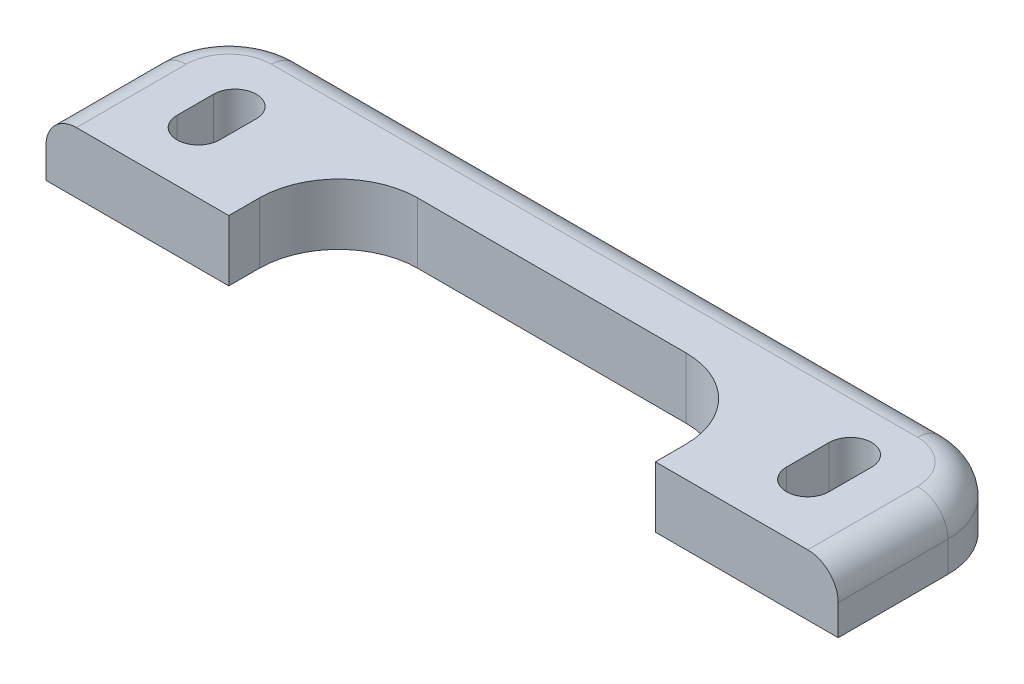
ISO-10303-21;
HEADER;
FILE_DESCRIPTION(('STEP AP214'),'2;1');
FILE_NAME('part.step','',(''),(''),'','','');
FILE_SCHEMA(('AUTOMOTIVE_DESIGN { 1 0 10303 214 1 1 1 1 }'));
ENDSEC;
DATA;
#1=APPLICATION_CONTEXT('core data for automotive mechanical design processes');
#2=APPLICATION_PROTOCOL_DEFINITION('international standard','automotive_design',2000,#1);
#3=PRODUCT_CONTEXT('',#1,'mechanical');
#4=PRODUCT('Part','Part','',(#3));
#5=PRODUCT_RELATED_PRODUCT_CATEGORY('part','',(#4));
#6=PRODUCT_DEFINITION_FORMATION('','',#4);
#7=PRODUCT_DEFINITION_CONTEXT('part definition',#1,'design');
#8=PRODUCT_DEFINITION('design','',#6,#7);
#9=PRODUCT_DEFINITION_SHAPE('','',#8);
#10=(LENGTH_UNIT() NAMED_UNIT(*) SI_UNIT(.MILLI.,.METRE.));
#11=(NAMED_UNIT(*) PLANE_ANGLE_UNIT() SI_UNIT($,.RADIAN.));
#12=(NAMED_UNIT(*) SI_UNIT($,.STERADIAN.) SOLID_ANGLE_UNIT());
#13=UNCERTAINTY_MEASURE_WITH_UNIT(LENGTH_MEASURE(1.E-05),#10,'distance_accuracy_value','');
#14=(GEOMETRIC_REPRESENTATION_CONTEXT(3) GLOBAL_UNCERTAINTY_ASSIGNED_CONTEXT((#13)) GLOBAL_UNIT_ASSIGNED_CONTEXT((#10,
#11,#12)) REPRESENTATION_CONTEXT('',''));
#15=CARTESIAN_POINT('',(0.,0.,0.));
#16=DIRECTION('',(0.,0.,1.));
#17=DIRECTION('',(1.,0.,0.));
#18=AXIS2_PLACEMENT_3D('',#15,#16,#17);
#19=CARTESIAN_POINT('',(-32.5,5.,0.));
#20=DIRECTION('',(0.,0.,-1.));
#21=DIRECTION('',(-1.,0.,0.));
#22=AXIS2_PLACEMENT_3D('',#19,#20,#21);
#23=PLANE('',#22);
#24=DIRECTION('',(1.,0.,0.));
#25=VECTOR('',#24,1.);
#26=CARTESIAN_POINT('',(-32.5,5.,0.));
#27=LINE('',#26,#25);
#28=CARTESIAN_POINT('',(-30.,5.,0.));
#29=VERTEX_POINT('',#28);
#30=CARTESIAN_POINT('',(-17.5,5.,0.));
#31=VERTEX_POINT('',#30);
#32=EDGE_CURVE('E317',#29,#31,#27,.T.);
#33=ORIENTED_EDGE('',*,*,#32,.F.);
#34=CARTESIAN_POINT('',(-30.,2.5,0.));
#35=DIRECTION('',(0.,0.,-1.));
#36=DIRECTION('',(-1.,0.,0.));
#37=AXIS2_PLACEMENT_3D('',#34,#35,#36);
#38=CIRCLE('',#37,2.5);
#39=CARTESIAN_POINT('',(-32.5,2.5,0.));
#40=VERTEX_POINT('',#39);
#41=EDGE_CURVE('E52',#29,#40,#38,.F.);
#42=ORIENTED_EDGE('',*,*,#41,.T.);
#43=DIRECTION('',(0.,-1.,0.));
#44=VECTOR('',#43,1.);
#45=CARTESIAN_POINT('',(-32.5,5.,0.));
#46=LINE('',#45,#44);
#47=CARTESIAN_POINT('',(-32.5,0.,0.));
#48=VERTEX_POINT('',#47);
#49=EDGE_CURVE('E331',#40,#48,#46,.T.);
#50=ORIENTED_EDGE('',*,*,#49,.T.);
#51=DIRECTION('',(1.,0.,0.));
#52=VECTOR('',#51,1.);
#53=CARTESIAN_POINT('',(-32.5,0.,0.));
#54=LINE('',#53,#52);
#55=CARTESIAN_POINT('',(-17.5,0.,0.));
#56=VERTEX_POINT('',#55);
#57=EDGE_CURVE('E321',#48,#56,#54,.T.);
#58=ORIENTED_EDGE('',*,*,#57,.T.);
#59=DIRECTION('',(0.,1.,0.));
#60=VECTOR('',#59,1.);
#61=CARTESIAN_POINT('',(-17.5,0.,0.));
#62=LINE('',#61,#60);
#63=EDGE_CURVE('E290',#56,#31,#62,.T.);
#64=ORIENTED_EDGE('',*,*,#63,.T.);
#65=EDGE_LOOP('',(#33,#42,#50,#58,#64));
#66=FACE_BOUND('',#65,.T.);
#67=ADVANCED_FACE('F43',(#66),#23,.F.);
#68=DIRECTION('',(0.,-1.,0.));
#69=VECTOR('',#68,1.);
#70=CARTESIAN_POINT('',(32.5,5.,0.));
#71=LINE('',#70,#69);
#72=CARTESIAN_POINT('',(32.5,2.5,0.));
#73=VERTEX_POINT('',#72);
#74=CARTESIAN_POINT('',(32.5,0.,0.));
#75=VERTEX_POINT('',#74);
#76=EDGE_CURVE('E319',#73,#75,#71,.T.);
#77=ORIENTED_EDGE('',*,*,#76,.F.);
#78=CARTESIAN_POINT('',(30.,2.5,0.));
#79=DIRECTION('',(0.,0.,-1.));
#80=DIRECTION('',(-1.,0.,0.));
#81=AXIS2_PLACEMENT_3D('',#78,#79,#80);
#82=CIRCLE('',#81,2.5);
#83=CARTESIAN_POINT('',(30.,5.,0.));
#84=VERTEX_POINT('',#83);
#85=EDGE_CURVE('E363',#73,#84,#82,.F.);
#86=ORIENTED_EDGE('',*,*,#85,.T.);
#87=CARTESIAN_POINT('',(17.5,5.,0.));
#88=VERTEX_POINT('',#87);
#89=EDGE_CURVE('E320',#88,#84,#27,.T.);
#90=ORIENTED_EDGE('',*,*,#89,.F.);
#91=DIRECTION('',(0.,1.,0.));
#92=VECTOR('',#91,1.);
#93=CARTESIAN_POINT('',(17.5,0.,0.));
#94=LINE('',#93,#92);
#95=CARTESIAN_POINT('',(17.5,0.,0.));
#96=VERTEX_POINT('',#95);
#97=EDGE_CURVE('E313',#96,#88,#94,.T.);
#98=ORIENTED_EDGE('',*,*,#97,.F.);
#99=EDGE_CURVE('E306',#96,#75,#54,.T.);
#100=ORIENTED_EDGE('',*,*,#99,.T.);
#101=EDGE_LOOP('',(#77,#86,#90,#98,#100));
#102=FACE_BOUND('',#101,.T.);
#103=ADVANCED_FACE('F421',(#102),#23,.F.);
#104=CARTESIAN_POINT('',(32.5,5.,-22.));
#105=DIRECTION('',(-1.,0.,0.));
#106=DIRECTION('',(0.,0.,1.));
#107=AXIS2_PLACEMENT_3D('',#104,#105,#106);
#108=PLANE('',#107);
#109=DIRECTION('',(0.,1.,0.));
#110=VECTOR('',#109,1.);
#111=CARTESIAN_POINT('',(32.5,5.,-9.00000000000001));
#112=LINE('',#111,#110);
#113=CARTESIAN_POINT('',(32.5,0.,-9.00000000000001));
#114=VERTEX_POINT('',#113);
#115=CARTESIAN_POINT('',(32.5,2.5,-9.00000000000001));
#116=VERTEX_POINT('',#115);
#117=EDGE_CURVE('E336',#114,#116,#112,.T.);
#118=ORIENTED_EDGE('',*,*,#117,.T.);
#119=DIRECTION('',(0.,0.,-1.));
#120=VECTOR('',#119,1.);
#121=CARTESIAN_POINT('',(32.5,2.5,-22.));
#122=LINE('',#121,#120);
#123=EDGE_CURVE('E361',#116,#73,#122,.F.);
#124=ORIENTED_EDGE('',*,*,#123,.T.);
#125=ORIENTED_EDGE('',*,*,#76,.T.);
#126=DIRECTION('',(0.,0.,-1.));
#127=VECTOR('',#126,1.);
#128=CARTESIAN_POINT('',(32.5,0.,-22.));
#129=LINE('',#128,#127);
#130=EDGE_CURVE('E324',#75,#114,#129,.T.);
#131=ORIENTED_EDGE('',*,*,#130,.T.);
#132=EDGE_LOOP('',(#118,#124,#125,#131));
#133=FACE_BOUND('',#132,.T.);
#134=ADVANCED_FACE('F441',(#133),#108,.F.);
#135=CARTESIAN_POINT('',(-32.5,5.,-11.9999999999999));
#136=DIRECTION('',(1.,0.,0.));
#137=DIRECTION('',(0.,0.,-1.));
#138=AXIS2_PLACEMENT_3D('',#135,#136,#137);
#139=PLANE('',#138);
#140=ORIENTED_EDGE('',*,*,#49,.F.);
#141=DIRECTION('',(0.,0.,1.));
#142=VECTOR('',#141,1.);
#143=CARTESIAN_POINT('',(-32.5,2.5,-11.9999999999999));
#144=LINE('',#143,#142);
#145=CARTESIAN_POINT('',(-32.5,2.5,-9.00000000000001));
#146=VERTEX_POINT('',#145);
#147=EDGE_CURVE('E11',#40,#146,#144,.F.);
#148=ORIENTED_EDGE('',*,*,#147,.T.);
#149=DIRECTION('',(0.,1.,0.));
#150=VECTOR('',#149,1.);
#151=CARTESIAN_POINT('',(-32.5,5.,-9.00000000000001));
#152=LINE('',#151,#150);
#153=CARTESIAN_POINT('',(-32.5,0.,-9.00000000000001));
#154=VERTEX_POINT('',#153);
#155=EDGE_CURVE('E348',#146,#154,#152,.F.);
#156=ORIENTED_EDGE('',*,*,#155,.T.);
#157=DIRECTION('',(0.,0.,1.));
#158=VECTOR('',#157,1.);
#159=CARTESIAN_POINT('',(-32.5,0.,-11.9999999999999));
#160=LINE('',#159,#158);
#161=EDGE_CURVE('E327',#154,#48,#160,.T.);
#162=ORIENTED_EDGE('',*,*,#161,.T.);
#163=EDGE_LOOP('',(#140,#148,#156,#162));
#164=FACE_BOUND('',#163,.T.);
#165=ADVANCED_FACE('F449',(#164),#139,.F.);
#166=CARTESIAN_POINT('',(0.,5.,0.));
#167=DIRECTION('',(0.,-1.,0.));
#168=DIRECTION('',(0.,0.,-1.));
#169=AXIS2_PLACEMENT_3D('',#166,#167,#168);
#170=PLANE('',#169);
#171=CARTESIAN_POINT('',(25.,5.,-8.50000000000001));
#172=DIRECTION('',(0.,1.,0.));
#173=DIRECTION('',(0.,0.,-1.));
#174=AXIS2_PLACEMENT_3D('',#171,#172,#173);
#175=CIRCLE('',#174,1.75);
#176=CARTESIAN_POINT('',(26.75,5.,-8.50000000000001));
#177=VERTEX_POINT('',#176);
#178=CARTESIAN_POINT('',(23.25,5.,-8.50000000000001));
#179=VERTEX_POINT('',#178);
#180=EDGE_CURVE('E244',#177,#179,#175,.T.);
#181=ORIENTED_EDGE('',*,*,#180,.F.);
#182=DIRECTION('',(0.,0.,-1.));
#183=VECTOR('',#182,1.);
#184=CARTESIAN_POINT('',(26.75,5.,-5.00000000000001));
#185=LINE('',#184,#183);
#186=CARTESIAN_POINT('',(26.75,5.,-5.00000000000001));
#187=VERTEX_POINT('',#186);
#188=EDGE_CURVE('E259',#187,#177,#185,.T.);
#189=ORIENTED_EDGE('',*,*,#188,.F.);
#190=CARTESIAN_POINT('',(25.,5.,-5.00000000000001));
#191=DIRECTION('',(0.,1.,0.));
#192=DIRECTION('',(0.,0.,1.));
#193=AXIS2_PLACEMENT_3D('',#190,#191,#192);
#194=CIRCLE('',#193,1.75);
#195=CARTESIAN_POINT('',(23.25,5.,-5.00000000000001));
#196=VERTEX_POINT('',#195);
#197=EDGE_CURVE('E269',#196,#187,#194,.T.);
#198=ORIENTED_EDGE('',*,*,#197,.F.);
#199=DIRECTION('',(0.,0.,1.));
#200=VECTOR('',#199,1.);
#201=CARTESIAN_POINT('',(23.25,5.,-5.00000000000001));
#202=LINE('',#201,#200);
#203=EDGE_CURVE('E257',#179,#196,#202,.T.);
#204=ORIENTED_EDGE('',*,*,#203,.F.);
#205=EDGE_LOOP('',(#181,#189,#198,#204));
#206=FACE_BOUND('',#205,.T.);
#207=CARTESIAN_POINT('',(-25.,5.,-8.00000000000001));
#208=DIRECTION('',(0.,1.,0.));
#209=DIRECTION('',(0.,0.,-1.));
#210=AXIS2_PLACEMENT_3D('',#207,#208,#209);
#211=CIRCLE('',#210,1.75);
#212=CARTESIAN_POINT('',(-23.25,5.,-8.00000000000001));
#213=VERTEX_POINT('',#212);
#214=CARTESIAN_POINT('',(-26.75,5.,-8.00000000000001));
#215=VERTEX_POINT('',#214);
#216=EDGE_CURVE('E224',#213,#215,#211,.T.);
#217=ORIENTED_EDGE('',*,*,#216,.F.);
#218=DIRECTION('',(0.,0.,-1.));
#219=VECTOR('',#218,1.);
#220=CARTESIAN_POINT('',(-23.25,5.,-5.00000000000001));
#221=LINE('',#220,#219);
#222=CARTESIAN_POINT('',(-23.25,5.,-5.00000000000001));
#223=VERTEX_POINT('',#222);
#224=EDGE_CURVE('E214',#223,#213,#221,.T.);
#225=ORIENTED_EDGE('',*,*,#224,.F.);
#226=CARTESIAN_POINT('',(-25.,5.,-5.00000000000001));
#227=DIRECTION('',(0.,1.,0.));
#228=DIRECTION('',(0.,0.,1.));
#229=AXIS2_PLACEMENT_3D('',#226,#227,#228);
#230=CIRCLE('',#229,1.75);
#231=CARTESIAN_POINT('',(-26.75,5.,-5.00000000000001));
#232=VERTEX_POINT('',#231);
#233=EDGE_CURVE('E264',#232,#223,#230,.T.);
#234=ORIENTED_EDGE('',*,*,#233,.F.);
#235=DIRECTION('',(0.,0.,1.));
#236=VECTOR('',#235,1.);
#237=CARTESIAN_POINT('',(-26.75,5.,-5.00000000000001));
#238=LINE('',#237,#236);
#239=EDGE_CURVE('E222',#215,#232,#238,.T.);
#240=ORIENTED_EDGE('',*,*,#239,.F.);
#241=EDGE_LOOP('',(#217,#225,#234,#240));
#242=FACE_BOUND('',#241,.T.);
#243=ORIENTED_EDGE('',*,*,#89,.T.);
#244=DIRECTION('',(0.,0.,-1.));
#245=VECTOR('',#244,1.);
#246=CARTESIAN_POINT('',(30.,5.,0.));
#247=LINE('',#246,#245);
#248=CARTESIAN_POINT('',(30.,5.,-9.00000000000001));
#249=VERTEX_POINT('',#248);
#250=EDGE_CURVE('E358',#84,#249,#247,.T.);
#251=ORIENTED_EDGE('',*,*,#250,.T.);
#252=CARTESIAN_POINT('',(26.5,5.,-9.00000000000001));
#253=DIRECTION('',(0.,-1.,0.));
#254=DIRECTION('',(0.,0.,-1.));
#255=AXIS2_PLACEMENT_3D('',#252,#253,#254);
#256=CIRCLE('',#255,3.5);
#257=CARTESIAN_POINT('',(26.5,5.,-12.5));
#258=VERTEX_POINT('',#257);
#259=EDGE_CURVE('E356',#249,#258,#256,.F.);
#260=ORIENTED_EDGE('',*,*,#259,.T.);
#261=DIRECTION('',(1.,0.,0.));
#262=VECTOR('',#261,1.);
#263=CARTESIAN_POINT('',(0.,5.,-12.5));
#264=LINE('',#263,#262);
#265=CARTESIAN_POINT('',(-26.5,5.,-12.5));
#266=VERTEX_POINT('',#265);
#267=EDGE_CURVE('E354',#258,#266,#264,.F.);
#268=ORIENTED_EDGE('',*,*,#267,.T.);
#269=CARTESIAN_POINT('',(-26.5,5.,-9.00000000000001));
#270=DIRECTION('',(0.,-1.,0.));
#271=DIRECTION('',(0.,0.,-1.));
#272=AXIS2_PLACEMENT_3D('',#269,#270,#271);
#273=CIRCLE('',#272,3.5);
#274=CARTESIAN_POINT('',(-30.,5.,-9.00000000000001));
#275=VERTEX_POINT('',#274);
#276=EDGE_CURVE('E352',#266,#275,#273,.F.);
#277=ORIENTED_EDGE('',*,*,#276,.T.);
#278=DIRECTION('',(0.,0.,1.));
#279=VECTOR('',#278,1.);
#280=CARTESIAN_POINT('',(-30.,5.,0.));
#281=LINE('',#280,#279);
#282=EDGE_CURVE('E350',#275,#29,#281,.T.);
#283=ORIENTED_EDGE('',*,*,#282,.T.);
#284=ORIENTED_EDGE('',*,*,#32,.T.);
#285=DIRECTION('',(0.,0.,1.));
#286=VECTOR('',#285,1.);
#287=CARTESIAN_POINT('',(-17.5,5.,0.));
#288=LINE('',#287,#286);
#289=CARTESIAN_POINT('',(-17.5,5.,-2.5));
#290=VERTEX_POINT('',#289);
#291=EDGE_CURVE('E267',#290,#31,#288,.T.);
#292=ORIENTED_EDGE('',*,*,#291,.F.);
#293=CARTESIAN_POINT('',(-11.,5.,-2.5));
#294=DIRECTION('',(0.,1.,0.));
#295=DIRECTION('',(0.,0.,-1.));
#296=AXIS2_PLACEMENT_3D('',#293,#294,#295);
#297=CIRCLE('',#296,6.5);
#298=CARTESIAN_POINT('',(-11.,5.,-9.00000000000001));
#299=VERTEX_POINT('',#298);
#300=EDGE_CURVE('E278',#299,#290,#297,.T.);
#301=ORIENTED_EDGE('',*,*,#300,.F.);
#302=DIRECTION('',(-1.,0.,0.));
#303=VECTOR('',#302,1.);
#304=CARTESIAN_POINT('',(-11.,5.,-9.00000000000001));
#305=LINE('',#304,#303);
#306=CARTESIAN_POINT('',(11.,5.,-9.00000000000001));
#307=VERTEX_POINT('',#306);
#308=EDGE_CURVE('E299',#307,#299,#305,.T.);
#309=ORIENTED_EDGE('',*,*,#308,.F.);
#310=CARTESIAN_POINT('',(11.,5.,-2.5));
#311=DIRECTION('',(0.,1.,0.));
#312=DIRECTION('',(0.,0.,-1.));
#313=AXIS2_PLACEMENT_3D('',#310,#311,#312);
#314=CIRCLE('',#313,6.5);
#315=CARTESIAN_POINT('',(17.5,5.,-2.5));
#316=VERTEX_POINT('',#315);
#317=EDGE_CURVE('E296',#316,#307,#314,.T.);
#318=ORIENTED_EDGE('',*,*,#317,.F.);
#319=DIRECTION('',(0.,0.,-1.));
#320=VECTOR('',#319,1.);
#321=CARTESIAN_POINT('',(17.5,5.,0.));
#322=LINE('',#321,#320);
#323=EDGE_CURVE('E293',#88,#316,#322,.T.);
#324=ORIENTED_EDGE('',*,*,#323,.F.);
#325=EDGE_LOOP('',(#243,#251,#260,#268,#277,#283,#284,#292,#301,#309,#318,#324));
#326=FACE_BOUND('',#325,.T.);
#327=ADVANCED_FACE('F392',(#206,#242,#326),#170,.F.);
#328=CARTESIAN_POINT('',(0.,0.,0.));
#329=DIRECTION('',(0.,-1.,0.));
#330=DIRECTION('',(0.,0.,-1.));
#331=AXIS2_PLACEMENT_3D('',#328,#329,#330);
#332=PLANE('',#331);
#333=DIRECTION('',(-1.,0.,0.));
#334=VECTOR('',#333,1.);
#335=CARTESIAN_POINT('',(0.,0.,-15.));
#336=LINE('',#335,#334);
#337=CARTESIAN_POINT('',(26.5,0.,-15.));
#338=VERTEX_POINT('',#337);
#339=CARTESIAN_POINT('',(-26.5,0.,-15.));
#340=VERTEX_POINT('',#339);
#341=EDGE_CURVE('E333',#338,#340,#336,.T.);
#342=ORIENTED_EDGE('',*,*,#341,.F.);
#343=CARTESIAN_POINT('',(26.5,0.,-9.00000000000001));
#344=DIRECTION('',(0.,-1.,0.));
#345=DIRECTION('',(0.,0.,-1.));
#346=AXIS2_PLACEMENT_3D('',#343,#344,#345);
#347=CIRCLE('',#346,6.);
#348=EDGE_CURVE('E346',#338,#114,#347,.T.);
#349=ORIENTED_EDGE('',*,*,#348,.T.);
#350=ORIENTED_EDGE('',*,*,#130,.F.);
#351=ORIENTED_EDGE('',*,*,#99,.F.);
#352=DIRECTION('',(0.,0.,-1.));
#353=VECTOR('',#352,1.);
#354=CARTESIAN_POINT('',(17.5,0.,0.));
#355=LINE('',#354,#353);
#356=CARTESIAN_POINT('',(17.5,0.,-2.5));
#357=VERTEX_POINT('',#356);
#358=EDGE_CURVE('E277',#96,#357,#355,.T.);
#359=ORIENTED_EDGE('',*,*,#358,.T.);
#360=CARTESIAN_POINT('',(11.,0.,-2.5));
#361=DIRECTION('',(0.,1.,0.));
#362=DIRECTION('',(0.,0.,-1.));
#363=AXIS2_PLACEMENT_3D('',#360,#361,#362);
#364=CIRCLE('',#363,6.5);
#365=CARTESIAN_POINT('',(11.,0.,-9.00000000000001));
#366=VERTEX_POINT('',#365);
#367=EDGE_CURVE('E281',#357,#366,#364,.T.);
#368=ORIENTED_EDGE('',*,*,#367,.T.);
#369=DIRECTION('',(-1.,0.,0.));
#370=VECTOR('',#369,1.);
#371=CARTESIAN_POINT('',(-11.,0.,-9.00000000000001));
#372=LINE('',#371,#370);
#373=CARTESIAN_POINT('',(-11.,0.,-9.00000000000001));
#374=VERTEX_POINT('',#373);
#375=EDGE_CURVE('E284',#366,#374,#372,.T.);
#376=ORIENTED_EDGE('',*,*,#375,.T.);
#377=CARTESIAN_POINT('',(-11.,0.,-2.5));
#378=DIRECTION('',(0.,1.,0.));
#379=DIRECTION('',(0.,0.,-1.));
#380=AXIS2_PLACEMENT_3D('',#377,#378,#379);
#381=CIRCLE('',#380,6.5);
#382=CARTESIAN_POINT('',(-17.5,0.,-2.5));
#383=VERTEX_POINT('',#382);
#384=EDGE_CURVE('E287',#374,#383,#381,.T.);
#385=ORIENTED_EDGE('',*,*,#384,.T.);
#386=DIRECTION('',(0.,0.,1.));
#387=VECTOR('',#386,1.);
#388=CARTESIAN_POINT('',(-17.5,0.,0.));
#389=LINE('',#388,#387);
#390=EDGE_CURVE('E274',#383,#56,#389,.T.);
#391=ORIENTED_EDGE('',*,*,#390,.T.);
#392=ORIENTED_EDGE('',*,*,#57,.F.);
#393=ORIENTED_EDGE('',*,*,#161,.F.);
#394=CARTESIAN_POINT('',(-26.5,0.,-9.00000000000001));
#395=DIRECTION('',(0.,-1.,0.));
#396=DIRECTION('',(0.,0.,-1.));
#397=AXIS2_PLACEMENT_3D('',#394,#395,#396);
#398=CIRCLE('',#397,6.);
#399=EDGE_CURVE('E344',#154,#340,#398,.T.);
#400=ORIENTED_EDGE('',*,*,#399,.T.);
#401=EDGE_LOOP('',(#342,#349,#350,#351,#359,#368,#376,#385,#391,#392,#393,#400));
#402=FACE_BOUND('',#401,.T.);
#403=DIRECTION('',(0.,0.,-1.));
#404=VECTOR('',#403,1.);
#405=CARTESIAN_POINT('',(-23.25,0.,-5.00000000000001));
#406=LINE('',#405,#404);
#407=CARTESIAN_POINT('',(-23.25,0.,-5.00000000000001));
#408=VERTEX_POINT('',#407);
#409=CARTESIAN_POINT('',(-23.25,0.,-8.00000000000001));
#410=VERTEX_POINT('',#409);
#411=EDGE_CURVE('E211',#408,#410,#406,.T.);
#412=ORIENTED_EDGE('',*,*,#411,.T.);
#413=CARTESIAN_POINT('',(-25.,0.,-8.00000000000001));
#414=DIRECTION('',(0.,-1.,0.));
#415=DIRECTION('',(0.,0.,-1.));
#416=AXIS2_PLACEMENT_3D('',#413,#414,#415);
#417=CIRCLE('',#416,1.75);
#418=CARTESIAN_POINT('',(-26.75,0.,-8.00000000000001));
#419=VERTEX_POINT('',#418);
#420=EDGE_CURVE('E198',#410,#419,#417,.F.);
#421=ORIENTED_EDGE('',*,*,#420,.T.);
#422=DIRECTION('',(0.,0.,1.));
#423=VECTOR('',#422,1.);
#424=CARTESIAN_POINT('',(-26.75,0.,-5.00000000000001));
#425=LINE('',#424,#423);
#426=CARTESIAN_POINT('',(-26.75,0.,-5.00000000000001));
#427=VERTEX_POINT('',#426);
#428=EDGE_CURVE('E229',#419,#427,#425,.T.);
#429=ORIENTED_EDGE('',*,*,#428,.T.);
#430=CARTESIAN_POINT('',(-25.,0.,-5.00000000000001));
#431=DIRECTION('',(0.,1.,0.));
#432=DIRECTION('',(0.,0.,1.));
#433=AXIS2_PLACEMENT_3D('',#430,#431,#432);
#434=CIRCLE('',#433,1.75);
#435=EDGE_CURVE('E221',#427,#408,#434,.T.);
#436=ORIENTED_EDGE('',*,*,#435,.T.);
#437=EDGE_LOOP('',(#412,#421,#429,#436));
#438=FACE_BOUND('',#437,.T.);
#439=DIRECTION('',(0.,0.,-1.));
#440=VECTOR('',#439,1.);
#441=CARTESIAN_POINT('',(26.75,0.,-5.00000000000001));
#442=LINE('',#441,#440);
#443=CARTESIAN_POINT('',(26.75,0.,-5.00000000000001));
#444=VERTEX_POINT('',#443);
#445=CARTESIAN_POINT('',(26.75,0.,-8.50000000000001));
#446=VERTEX_POINT('',#445);
#447=EDGE_CURVE('E245',#444,#446,#442,.T.);
#448=ORIENTED_EDGE('',*,*,#447,.T.);
#449=CARTESIAN_POINT('',(25.,0.,-8.50000000000001));
#450=DIRECTION('',(0.,-1.,0.));
#451=DIRECTION('',(0.,0.,-1.));
#452=AXIS2_PLACEMENT_3D('',#449,#450,#451);
#453=CIRCLE('',#452,1.75);
#454=CARTESIAN_POINT('',(23.25,0.,-8.50000000000001));
#455=VERTEX_POINT('',#454);
#456=EDGE_CURVE('E248',#446,#455,#453,.F.);
#457=ORIENTED_EDGE('',*,*,#456,.T.);
#458=DIRECTION('',(0.,0.,1.));
#459=VECTOR('',#458,1.);
#460=CARTESIAN_POINT('',(23.25,0.,-5.00000000000001));
#461=LINE('',#460,#459);
#462=CARTESIAN_POINT('',(23.25,0.,-5.00000000000001));
#463=VERTEX_POINT('',#462);
#464=EDGE_CURVE('E241',#455,#463,#461,.T.);
#465=ORIENTED_EDGE('',*,*,#464,.T.);
#466=CARTESIAN_POINT('',(25.,0.,-5.00000000000001));
#467=DIRECTION('',(0.,1.,0.));
#468=DIRECTION('',(0.,0.,1.));
#469=AXIS2_PLACEMENT_3D('',#466,#467,#468);
#470=CIRCLE('',#469,1.75);
#471=EDGE_CURVE('E237',#463,#444,#470,.T.);
#472=ORIENTED_EDGE('',*,*,#471,.T.);
#473=EDGE_LOOP('',(#448,#457,#465,#472));
#474=FACE_BOUND('',#473,.T.);
#475=ADVANCED_FACE('F218',(#402,#438,#474),#332,.T.);
#476=CARTESIAN_POINT('',(-17.5,0.,0.));
#477=DIRECTION('',(-1.,0.,0.));
#478=DIRECTION('',(0.,0.,1.));
#479=AXIS2_PLACEMENT_3D('',#476,#477,#478);
#480=PLANE('',#479);
#481=ORIENTED_EDGE('',*,*,#291,.T.);
#482=ORIENTED_EDGE('',*,*,#63,.F.);
#483=ORIENTED_EDGE('',*,*,#390,.F.);
#484=DIRECTION('',(0.,1.,0.));
#485=VECTOR('',#484,1.);
#486=CARTESIAN_POINT('',(-17.5,0.,-2.5));
#487=LINE('',#486,#485);
#488=EDGE_CURVE('E304',#383,#290,#487,.T.);
#489=ORIENTED_EDGE('',*,*,#488,.T.);
#490=EDGE_LOOP('',(#481,#482,#483,#489));
#491=FACE_BOUND('',#490,.T.);
#492=ADVANCED_FACE('F397',(#491),#480,.F.);
#493=CARTESIAN_POINT('',(-11.,0.,-2.5));
#494=DIRECTION('',(0.,1.,0.));
#495=DIRECTION('',(0.,0.,1.));
#496=AXIS2_PLACEMENT_3D('',#493,#494,#495);
#497=CYLINDRICAL_SURFACE('',#496,6.5);
#498=ORIENTED_EDGE('',*,*,#300,.T.);
#499=ORIENTED_EDGE('',*,*,#488,.F.);
#500=ORIENTED_EDGE('',*,*,#384,.F.);
#501=DIRECTION('',(0.,1.,0.));
#502=VECTOR('',#501,1.);
#503=CARTESIAN_POINT('',(-11.,0.,-9.00000000000001));
#504=LINE('',#503,#502);
#505=EDGE_CURVE('E307',#374,#299,#504,.T.);
#506=ORIENTED_EDGE('',*,*,#505,.T.);
#507=EDGE_LOOP('',(#498,#499,#500,#506));
#508=FACE_BOUND('',#507,.T.);
#509=ADVANCED_FACE('F404',(#508),#497,.F.);
#510=CARTESIAN_POINT('',(-11.,0.,-9.00000000000001));
#511=DIRECTION('',(0.,0.,-1.));
#512=DIRECTION('',(-1.,0.,0.));
#513=AXIS2_PLACEMENT_3D('',#510,#511,#512);
#514=PLANE('',#513);
#515=ORIENTED_EDGE('',*,*,#308,.T.);
#516=ORIENTED_EDGE('',*,*,#505,.F.);
#517=ORIENTED_EDGE('',*,*,#375,.F.);
#518=DIRECTION('',(0.,1.,0.));
#519=VECTOR('',#518,1.);
#520=CARTESIAN_POINT('',(11.,0.,-9.00000000000001));
#521=LINE('',#520,#519);
#522=EDGE_CURVE('E309',#366,#307,#521,.T.);
#523=ORIENTED_EDGE('',*,*,#522,.T.);
#524=EDGE_LOOP('',(#515,#516,#517,#523));
#525=FACE_BOUND('',#524,.T.);
#526=ADVANCED_FACE('F410',(#525),#514,.F.);
#527=CARTESIAN_POINT('',(11.,0.,-2.5));
#528=DIRECTION('',(0.,1.,0.));
#529=DIRECTION('',(0.,0.,1.));
#530=AXIS2_PLACEMENT_3D('',#527,#528,#529);
#531=CYLINDRICAL_SURFACE('',#530,6.5);
#532=ORIENTED_EDGE('',*,*,#317,.T.);
#533=ORIENTED_EDGE('',*,*,#522,.F.);
#534=ORIENTED_EDGE('',*,*,#367,.F.);
#535=DIRECTION('',(0.,1.,0.));
#536=VECTOR('',#535,1.);
#537=CARTESIAN_POINT('',(17.5,0.,-2.5));
#538=LINE('',#537,#536);
#539=EDGE_CURVE('E311',#357,#316,#538,.T.);
#540=ORIENTED_EDGE('',*,*,#539,.T.);
#541=EDGE_LOOP('',(#532,#533,#534,#540));
#542=FACE_BOUND('',#541,.T.);
#543=ADVANCED_FACE('F412',(#542),#531,.F.);
#544=CARTESIAN_POINT('',(17.5,0.,0.));
#545=DIRECTION('',(1.,0.,0.));
#546=DIRECTION('',(0.,0.,-1.));
#547=AXIS2_PLACEMENT_3D('',#544,#545,#546);
#548=PLANE('',#547);
#549=ORIENTED_EDGE('',*,*,#323,.T.);
#550=ORIENTED_EDGE('',*,*,#539,.F.);
#551=ORIENTED_EDGE('',*,*,#358,.F.);
#552=ORIENTED_EDGE('',*,*,#97,.T.);
#553=EDGE_LOOP('',(#549,#550,#551,#552));
#554=FACE_BOUND('',#553,.T.);
#555=ADVANCED_FACE('F415',(#554),#548,.F.);
#556=CARTESIAN_POINT('',(-25.,0.,-5.00000000000001));
#557=DIRECTION('',(0.,1.,0.));
#558=DIRECTION('',(0.,0.,1.));
#559=AXIS2_PLACEMENT_3D('',#556,#557,#558);
#560=CYLINDRICAL_SURFACE('',#559,1.75);
#561=ORIENTED_EDGE('',*,*,#233,.T.);
#562=DIRECTION('',(0.,1.,0.));
#563=VECTOR('',#562,1.);
#564=CARTESIAN_POINT('',(-23.25,-6.30971473206198,-5.00000000000001));
#565=LINE('',#564,#563);
#566=EDGE_CURVE('E234',#408,#223,#565,.T.);
#567=ORIENTED_EDGE('',*,*,#566,.F.);
#568=ORIENTED_EDGE('',*,*,#435,.F.);
#569=DIRECTION('',(0.,1.,0.));
#570=VECTOR('',#569,1.);
#571=CARTESIAN_POINT('',(-26.75,-6.30971473206198,-5.00000000000001));
#572=LINE('',#571,#570);
#573=EDGE_CURVE('E230',#427,#232,#572,.T.);
#574=ORIENTED_EDGE('',*,*,#573,.T.);
#575=EDGE_LOOP('',(#561,#567,#568,#574));
#576=FACE_BOUND('',#575,.T.);
#577=ADVANCED_FACE('F574',(#576),#560,.F.);
#578=CARTESIAN_POINT('',(25.,0.,-5.00000000000001));
#579=DIRECTION('',(0.,1.,0.));
#580=DIRECTION('',(0.,0.,1.));
#581=AXIS2_PLACEMENT_3D('',#578,#579,#580);
#582=CYLINDRICAL_SURFACE('',#581,1.75);
#583=ORIENTED_EDGE('',*,*,#197,.T.);
#584=DIRECTION('',(0.,1.,0.));
#585=VECTOR('',#584,1.);
#586=CARTESIAN_POINT('',(26.75,-6.30971473206198,-5.00000000000001));
#587=LINE('',#586,#585);
#588=EDGE_CURVE('E242',#444,#187,#587,.T.);
#589=ORIENTED_EDGE('',*,*,#588,.F.);
#590=ORIENTED_EDGE('',*,*,#471,.F.);
#591=DIRECTION('',(0.,1.,0.));
#592=VECTOR('',#591,1.);
#593=CARTESIAN_POINT('',(23.25,-6.30971473206198,-5.00000000000001));
#594=LINE('',#593,#592);
#595=EDGE_CURVE('E238',#463,#196,#594,.T.);
#596=ORIENTED_EDGE('',*,*,#595,.T.);
#597=EDGE_LOOP('',(#583,#589,#590,#596));
#598=FACE_BOUND('',#597,.T.);
#599=ADVANCED_FACE('F565',(#598),#582,.F.);
#600=CARTESIAN_POINT('',(26.75,-6.30971473206198,-5.00000000000001));
#601=DIRECTION('',(1.,0.,0.));
#602=DIRECTION('',(0.,0.,-1.));
#603=AXIS2_PLACEMENT_3D('',#600,#601,#602);
#604=PLANE('',#603);
#605=ORIENTED_EDGE('',*,*,#588,.T.);
#606=ORIENTED_EDGE('',*,*,#188,.T.);
#607=DIRECTION('',(0.,1.,0.));
#608=VECTOR('',#607,1.);
#609=CARTESIAN_POINT('',(26.75,-6.30971473206198,-8.50000000000001));
#610=LINE('',#609,#608);
#611=EDGE_CURVE('E246',#446,#177,#610,.T.);
#612=ORIENTED_EDGE('',*,*,#611,.F.);
#613=ORIENTED_EDGE('',*,*,#447,.F.);
#614=EDGE_LOOP('',(#605,#606,#612,#613));
#615=FACE_BOUND('',#614,.T.);
#616=ADVANCED_FACE('F556',(#615),#604,.F.);
#617=CARTESIAN_POINT('',(25.,-6.30971473206198,-8.50000000000001));
#618=DIRECTION('',(0.,1.,0.));
#619=DIRECTION('',(0.,0.,1.));
#620=AXIS2_PLACEMENT_3D('',#617,#618,#619);
#621=CYLINDRICAL_SURFACE('',#620,1.75);
#622=ORIENTED_EDGE('',*,*,#611,.T.);
#623=ORIENTED_EDGE('',*,*,#180,.T.);
#624=DIRECTION('',(0.,1.,0.));
#625=VECTOR('',#624,1.);
#626=CARTESIAN_POINT('',(23.25,-6.30971473206198,-8.50000000000001));
#627=LINE('',#626,#625);
#628=EDGE_CURVE('E249',#455,#179,#627,.T.);
#629=ORIENTED_EDGE('',*,*,#628,.F.);
#630=ORIENTED_EDGE('',*,*,#456,.F.);
#631=EDGE_LOOP('',(#622,#623,#629,#630));
#632=FACE_BOUND('',#631,.T.);
#633=ADVANCED_FACE('F547',(#632),#621,.F.);
#634=CARTESIAN_POINT('',(23.25,-6.30971473206198,-5.00000000000001));
#635=DIRECTION('',(-1.,0.,0.));
#636=DIRECTION('',(0.,0.,1.));
#637=AXIS2_PLACEMENT_3D('',#634,#635,#636);
#638=PLANE('',#637);
#639=ORIENTED_EDGE('',*,*,#628,.T.);
#640=ORIENTED_EDGE('',*,*,#203,.T.);
#641=ORIENTED_EDGE('',*,*,#595,.F.);
#642=ORIENTED_EDGE('',*,*,#464,.F.);
#643=EDGE_LOOP('',(#639,#640,#641,#642));
#644=FACE_BOUND('',#643,.T.);
#645=ADVANCED_FACE('F539',(#644),#638,.F.);
#646=CARTESIAN_POINT('',(-23.25,-6.30971473206198,-5.00000000000001));
#647=DIRECTION('',(1.,0.,0.));
#648=DIRECTION('',(0.,0.,-1.));
#649=AXIS2_PLACEMENT_3D('',#646,#647,#648);
#650=PLANE('',#649);
#651=ORIENTED_EDGE('',*,*,#566,.T.);
#652=ORIENTED_EDGE('',*,*,#224,.T.);
#653=DIRECTION('',(0.,1.,0.));
#654=VECTOR('',#653,1.);
#655=CARTESIAN_POINT('',(-23.25,-6.30971473206198,-8.00000000000001));
#656=LINE('',#655,#654);
#657=EDGE_CURVE('E202',#410,#213,#656,.T.);
#658=ORIENTED_EDGE('',*,*,#657,.F.);
#659=ORIENTED_EDGE('',*,*,#411,.F.);
#660=EDGE_LOOP('',(#651,#652,#658,#659));
#661=FACE_BOUND('',#660,.T.);
#662=ADVANCED_FACE('F210',(#661),#650,.F.);
#663=CARTESIAN_POINT('',(-25.,-6.30971473206198,-8.00000000000001));
#664=DIRECTION('',(0.,1.,0.));
#665=DIRECTION('',(0.,0.,1.));
#666=AXIS2_PLACEMENT_3D('',#663,#664,#665);
#667=CYLINDRICAL_SURFACE('',#666,1.75);
#668=ORIENTED_EDGE('',*,*,#657,.T.);
#669=ORIENTED_EDGE('',*,*,#216,.T.);
#670=DIRECTION('',(0.,1.,0.));
#671=VECTOR('',#670,1.);
#672=CARTESIAN_POINT('',(-26.75,-6.30971473206198,-8.00000000000001));
#673=LINE('',#672,#671);
#674=EDGE_CURVE('E204',#419,#215,#673,.T.);
#675=ORIENTED_EDGE('',*,*,#674,.F.);
#676=ORIENTED_EDGE('',*,*,#420,.F.);
#677=EDGE_LOOP('',(#668,#669,#675,#676));
#678=FACE_BOUND('',#677,.T.);
#679=ADVANCED_FACE('F200',(#678),#667,.F.);
#680=CARTESIAN_POINT('',(-26.75,-6.30971473206198,-5.00000000000001));
#681=DIRECTION('',(-1.,0.,0.));
#682=DIRECTION('',(0.,0.,1.));
#683=AXIS2_PLACEMENT_3D('',#680,#681,#682);
#684=PLANE('',#683);
#685=ORIENTED_EDGE('',*,*,#674,.T.);
#686=ORIENTED_EDGE('',*,*,#239,.T.);
#687=ORIENTED_EDGE('',*,*,#573,.F.);
#688=ORIENTED_EDGE('',*,*,#428,.F.);
#689=EDGE_LOOP('',(#685,#686,#687,#688));
#690=FACE_BOUND('',#689,.T.);
#691=ADVANCED_FACE('F498',(#690),#684,.F.);
#692=CARTESIAN_POINT('',(-32.5,-5.,-15.));
#693=DIRECTION('',(0.,0.,1.));
#694=DIRECTION('',(1.,0.,0.));
#695=AXIS2_PLACEMENT_3D('',#692,#693,#694);
#696=PLANE('',#695);
#697=DIRECTION('',(0.,1.,0.));
#698=VECTOR('',#697,1.);
#699=CARTESIAN_POINT('',(-26.5,-5.,-15.));
#700=LINE('',#699,#698);
#701=CARTESIAN_POINT('',(-26.5,2.5,-15.));
#702=VERTEX_POINT('',#701);
#703=EDGE_CURVE('E339',#340,#702,#700,.T.);
#704=ORIENTED_EDGE('',*,*,#703,.T.);
#705=DIRECTION('',(1.,0.,0.));
#706=VECTOR('',#705,1.);
#707=CARTESIAN_POINT('',(-32.5,2.5,-15.));
#708=LINE('',#707,#706);
#709=CARTESIAN_POINT('',(26.5,2.5,-15.));
#710=VERTEX_POINT('',#709);
#711=EDGE_CURVE('E367',#702,#710,#708,.T.);
#712=ORIENTED_EDGE('',*,*,#711,.T.);
#713=DIRECTION('',(0.,1.,0.));
#714=VECTOR('',#713,1.);
#715=CARTESIAN_POINT('',(26.5,-5.,-15.));
#716=LINE('',#715,#714);
#717=EDGE_CURVE('E342',#710,#338,#716,.F.);
#718=ORIENTED_EDGE('',*,*,#717,.T.);
#719=ORIENTED_EDGE('',*,*,#341,.T.);
#720=EDGE_LOOP('',(#704,#712,#718,#719));
#721=FACE_BOUND('',#720,.T.);
#722=ADVANCED_FACE('F446',(#721),#696,.F.);
#723=CARTESIAN_POINT('',(26.5,5.,-9.00000000000001));
#724=DIRECTION('',(0.,1.,0.));
#725=DIRECTION('',(0.,0.,1.));
#726=AXIS2_PLACEMENT_3D('',#723,#724,#725);
#727=CYLINDRICAL_SURFACE('',#726,6.);
#728=ORIENTED_EDGE('',*,*,#717,.F.);
#729=CARTESIAN_POINT('',(26.5,2.5,-9.00000000000001));
#730=DIRECTION('',(0.,-1.,0.));
#731=DIRECTION('',(0.,0.,-1.));
#732=AXIS2_PLACEMENT_3D('',#729,#730,#731);
#733=CIRCLE('',#732,6.);
#734=EDGE_CURVE('E365',#710,#116,#733,.T.);
#735=ORIENTED_EDGE('',*,*,#734,.T.);
#736=ORIENTED_EDGE('',*,*,#117,.F.);
#737=ORIENTED_EDGE('',*,*,#348,.F.);
#738=EDGE_LOOP('',(#728,#735,#736,#737));
#739=FACE_BOUND('',#738,.T.);
#740=ADVANCED_FACE('F438',(#739),#727,.T.);
#741=CARTESIAN_POINT('',(-26.5,-5.,-9.00000000000001));
#742=DIRECTION('',(0.,1.,0.));
#743=DIRECTION('',(0.,0.,1.));
#744=AXIS2_PLACEMENT_3D('',#741,#742,#743);
#745=CYLINDRICAL_SURFACE('',#744,6.);
#746=ORIENTED_EDGE('',*,*,#155,.F.);
#747=CARTESIAN_POINT('',(-26.5,2.5,-9.00000000000001));
#748=DIRECTION('',(0.,-1.,0.));
#749=DIRECTION('',(0.,0.,-1.));
#750=AXIS2_PLACEMENT_3D('',#747,#748,#749);
#751=CIRCLE('',#750,6.);
#752=EDGE_CURVE('E369',#146,#702,#751,.T.);
#753=ORIENTED_EDGE('',*,*,#752,.T.);
#754=ORIENTED_EDGE('',*,*,#703,.F.);
#755=ORIENTED_EDGE('',*,*,#399,.F.);
#756=EDGE_LOOP('',(#746,#753,#754,#755));
#757=FACE_BOUND('',#756,.T.);
#758=ADVANCED_FACE('F448',(#757),#745,.T.);
#759=CARTESIAN_POINT('',(-30.,2.5,0.));
#760=DIRECTION('',(0.,0.,1.));
#761=DIRECTION('',(1.,0.,0.));
#762=AXIS2_PLACEMENT_3D('',#759,#760,#761);
#763=CYLINDRICAL_SURFACE('',#762,2.5);
#764=ORIENTED_EDGE('',*,*,#41,.F.);
#765=ORIENTED_EDGE('',*,*,#282,.F.);
#766=CARTESIAN_POINT('',(-30.,2.5,-9.00000000000001));
#767=DIRECTION('',(0.,0.,-1.));
#768=DIRECTION('',(-1.,0.,0.));
#769=AXIS2_PLACEMENT_3D('',#766,#767,#768);
#770=CIRCLE('',#769,2.5);
#771=EDGE_CURVE('E47',#146,#275,#770,.T.);
#772=ORIENTED_EDGE('',*,*,#771,.F.);
#773=ORIENTED_EDGE('',*,*,#147,.F.);
#774=EDGE_LOOP('',(#764,#765,#772,#773));
#775=FACE_BOUND('',#774,.T.);
#776=ADVANCED_FACE('F45',(#775),#763,.T.);
#777=CARTESIAN_POINT('',(-26.5,2.5,-9.00000000000001));
#778=DIRECTION('',(0.,-1.,0.));
#779=DIRECTION('',(0.,0.,-1.));
#780=AXIS2_PLACEMENT_3D('',#777,#778,#779);
#781=TOROIDAL_SURFACE('',#780,3.5,2.5);
#782=ORIENTED_EDGE('',*,*,#771,.T.);
#783=ORIENTED_EDGE('',*,*,#276,.F.);
#784=CARTESIAN_POINT('',(-26.5,2.5,-12.5));
#785=DIRECTION('',(1.,0.,0.));
#786=DIRECTION('',(0.,0.,-1.));
#787=AXIS2_PLACEMENT_3D('',#784,#785,#786);
#788=CIRCLE('',#787,2.5);
#789=EDGE_CURVE('E376',#702,#266,#788,.T.);
#790=ORIENTED_EDGE('',*,*,#789,.F.);
#791=ORIENTED_EDGE('',*,*,#752,.F.);
#792=EDGE_LOOP('',(#782,#783,#790,#791));
#793=FACE_BOUND('',#792,.T.);
#794=ADVANCED_FACE('F387',(#793),#781,.T.);
#795=CARTESIAN_POINT('',(-32.5,2.5,-12.5));
#796=DIRECTION('',(1.,0.,0.));
#797=DIRECTION('',(0.,0.,-1.));
#798=AXIS2_PLACEMENT_3D('',#795,#796,#797);
#799=CYLINDRICAL_SURFACE('',#798,2.5);
#800=ORIENTED_EDGE('',*,*,#789,.T.);
#801=ORIENTED_EDGE('',*,*,#267,.F.);
#802=CARTESIAN_POINT('',(26.5,2.5,-12.5));
#803=DIRECTION('',(1.,0.,0.));
#804=DIRECTION('',(0.,0.,-1.));
#805=AXIS2_PLACEMENT_3D('',#802,#803,#804);
#806=CIRCLE('',#805,2.5);
#807=EDGE_CURVE('E374',#710,#258,#806,.T.);
#808=ORIENTED_EDGE('',*,*,#807,.F.);
#809=ORIENTED_EDGE('',*,*,#711,.F.);
#810=EDGE_LOOP('',(#800,#801,#808,#809));
#811=FACE_BOUND('',#810,.T.);
#812=ADVANCED_FACE('F432',(#811),#799,.T.);
#813=CARTESIAN_POINT('',(26.5,2.5,-9.00000000000001));
#814=DIRECTION('',(0.,-1.,0.));
#815=DIRECTION('',(0.,0.,-1.));
#816=AXIS2_PLACEMENT_3D('',#813,#814,#815);
#817=TOROIDAL_SURFACE('',#816,3.5,2.5);
#818=ORIENTED_EDGE('',*,*,#807,.T.);
#819=ORIENTED_EDGE('',*,*,#259,.F.);
#820=CARTESIAN_POINT('',(30.,2.5,-9.00000000000001));
#821=DIRECTION('',(0.,0.,1.));
#822=DIRECTION('',(1.,0.,0.));
#823=AXIS2_PLACEMENT_3D('',#820,#821,#822);
#824=CIRCLE('',#823,2.5);
#825=EDGE_CURVE('E372',#116,#249,#824,.T.);
#826=ORIENTED_EDGE('',*,*,#825,.F.);
#827=ORIENTED_EDGE('',*,*,#734,.F.);
#828=EDGE_LOOP('',(#818,#819,#826,#827));
#829=FACE_BOUND('',#828,.T.);
#830=ADVANCED_FACE('F434',(#829),#817,.T.);
#831=CARTESIAN_POINT('',(30.,2.5,0.));
#832=DIRECTION('',(0.,0.,-1.));
#833=DIRECTION('',(-1.,0.,0.));
#834=AXIS2_PLACEMENT_3D('',#831,#832,#833);
#835=CYLINDRICAL_SURFACE('',#834,2.5);
#836=ORIENTED_EDGE('',*,*,#85,.F.);
#837=ORIENTED_EDGE('',*,*,#123,.F.);
#838=ORIENTED_EDGE('',*,*,#825,.T.);
#839=ORIENTED_EDGE('',*,*,#250,.F.);
#840=EDGE_LOOP('',(#836,#837,#838,#839));
#841=FACE_BOUND('',#840,.T.);
#842=ADVANCED_FACE('F427',(#841),#835,.T.);
#843=CLOSED_SHELL('',(#67,#103,#134,#165,#327,#475,#492,#509,#526,#543,#555,#577,#599,#616,#633,
#645,#662,#679,#691,#722,#740,#758,#776,#794,#812,#830,#842));
#844=MANIFOLD_SOLID_BREP('B2',#843);
#845=ADVANCED_BREP_SHAPE_REPRESENTATION('',(#18,#844),#14);
#846=SHAPE_DEFINITION_REPRESENTATION(#9,#845);
ENDSEC;
END-ISO-10303-21;
